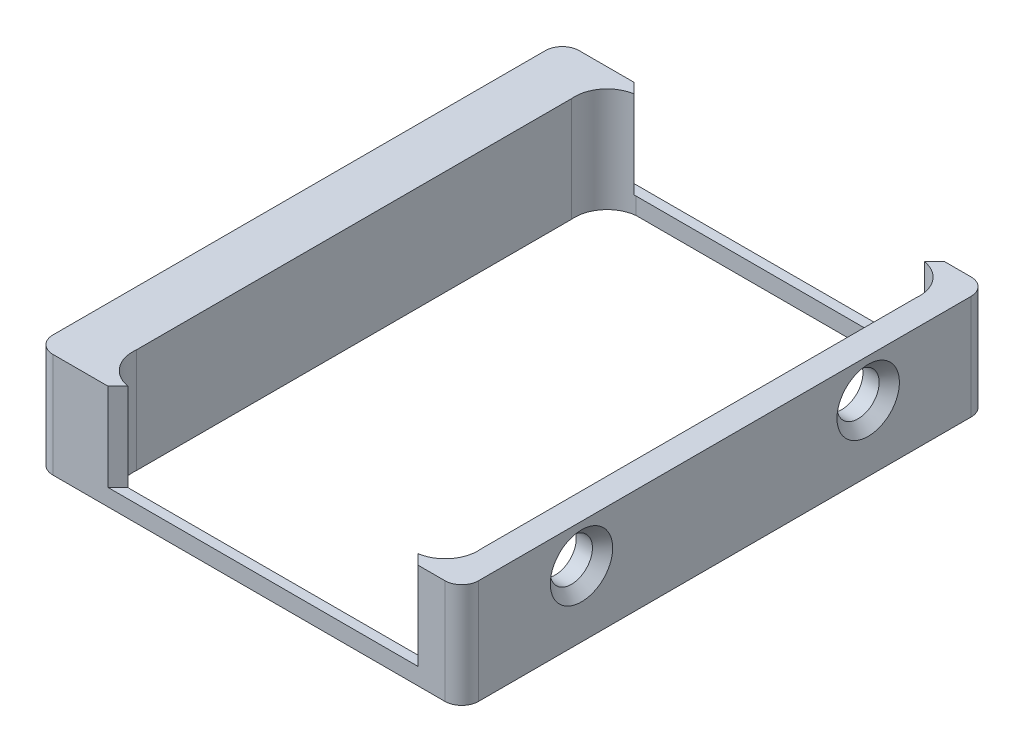
ISO-10303-21;
HEADER;
FILE_DESCRIPTION(('STEP AP214'),'2;1');
FILE_NAME('part.step','',(''),(''),'','','');
FILE_SCHEMA(('AUTOMOTIVE_DESIGN { 1 0 10303 214 1 1 1 1 }'));
ENDSEC;
DATA;
#1=APPLICATION_CONTEXT('core data for automotive mechanical design processes');
#2=APPLICATION_PROTOCOL_DEFINITION('international standard','automotive_design',2000,#1);
#3=PRODUCT_CONTEXT('',#1,'mechanical');
#4=PRODUCT('Part','Part','',(#3));
#5=PRODUCT_RELATED_PRODUCT_CATEGORY('part','',(#4));
#6=PRODUCT_DEFINITION_FORMATION('','',#4);
#7=PRODUCT_DEFINITION_CONTEXT('part definition',#1,'design');
#8=PRODUCT_DEFINITION('design','',#6,#7);
#9=PRODUCT_DEFINITION_SHAPE('','',#8);
#10=(LENGTH_UNIT() NAMED_UNIT(*) SI_UNIT(.MILLI.,.METRE.));
#11=(NAMED_UNIT(*) PLANE_ANGLE_UNIT() SI_UNIT($,.RADIAN.));
#12=(NAMED_UNIT(*) SI_UNIT($,.STERADIAN.) SOLID_ANGLE_UNIT());
#13=UNCERTAINTY_MEASURE_WITH_UNIT(LENGTH_MEASURE(1.E-05),#10,'distance_accuracy_value','');
#14=(GEOMETRIC_REPRESENTATION_CONTEXT(3) GLOBAL_UNCERTAINTY_ASSIGNED_CONTEXT((#13)) GLOBAL_UNIT_ASSIGNED_CONTEXT((#10,
#11,#12)) REPRESENTATION_CONTEXT('',''));
#15=CARTESIAN_POINT('',(0.,0.,0.));
#16=DIRECTION('',(0.,0.,1.));
#17=DIRECTION('',(1.,0.,0.));
#18=AXIS2_PLACEMENT_3D('',#15,#16,#17);
#19=CARTESIAN_POINT('',(58.9,31.,78.));
#20=DIRECTION('',(-1.,0.,0.));
#21=DIRECTION('',(0.,0.,1.));
#22=AXIS2_PLACEMENT_3D('',#19,#20,#21);
#23=PLANE('',#22);
#24=CARTESIAN_POINT('',(58.9,19.55,-42.5));
#25=DIRECTION('',(-1.,0.,0.));
#26=DIRECTION('',(0.,0.,1.));
#27=AXIS2_PLACEMENT_3D('',#24,#25,#26);
#28=CIRCLE('',#27,9.25000000000001);
#29=CARTESIAN_POINT('',(58.9,19.55,-33.25));
#30=VERTEX_POINT('',#29);
#31=EDGE_CURVE('E57',#30,#30,#28,.T.);
#32=ORIENTED_EDGE('',*,*,#31,.T.);
#33=EDGE_LOOP('',(#32));
#34=FACE_BOUND('',#33,.T.);
#35=CARTESIAN_POINT('',(58.9,19.55,42.5));
#36=DIRECTION('',(-1.,0.,0.));
#37=DIRECTION('',(0.,0.,1.));
#38=AXIS2_PLACEMENT_3D('',#35,#36,#37);
#39=CIRCLE('',#38,9.25000000000004);
#40=CARTESIAN_POINT('',(58.9,19.55,51.75));
#41=VERTEX_POINT('',#40);
#42=EDGE_CURVE('E481',#41,#41,#39,.T.);
#43=ORIENTED_EDGE('',*,*,#42,.T.);
#44=EDGE_LOOP('',(#43));
#45=FACE_BOUND('',#44,.T.);
#46=DIRECTION('',(0.,0.,-1.));
#47=VECTOR('',#46,1.);
#48=CARTESIAN_POINT('',(58.9,0.,78.));
#49=LINE('',#48,#47);
#50=CARTESIAN_POINT('',(58.9,0.,73.));
#51=VERTEX_POINT('',#50);
#52=CARTESIAN_POINT('',(58.9,0.,-73.));
#53=VERTEX_POINT('',#52);
#54=EDGE_CURVE('E396',#51,#53,#49,.T.);
#55=ORIENTED_EDGE('',*,*,#54,.T.);
#56=DIRECTION('',(0.,-1.,0.));
#57=VECTOR('',#56,1.);
#58=CARTESIAN_POINT('',(58.9,31.,-73.));
#59=LINE('',#58,#57);
#60=CARTESIAN_POINT('',(58.9,31.,-73.));
#61=VERTEX_POINT('',#60);
#62=EDGE_CURVE('E72',#53,#61,#59,.F.);
#63=ORIENTED_EDGE('',*,*,#62,.T.);
#64=DIRECTION('',(0.,0.,-1.));
#65=VECTOR('',#64,1.);
#66=CARTESIAN_POINT('',(58.9,31.,78.));
#67=LINE('',#66,#65);
#68=CARTESIAN_POINT('',(58.9,31.,73.));
#69=VERTEX_POINT('',#68);
#70=EDGE_CURVE('E382',#69,#61,#67,.T.);
#71=ORIENTED_EDGE('',*,*,#70,.F.);
#72=DIRECTION('',(0.,-1.,0.));
#73=VECTOR('',#72,1.);
#74=CARTESIAN_POINT('',(58.9,31.,73.));
#75=LINE('',#74,#73);
#76=EDGE_CURVE('E452',#69,#51,#75,.T.);
#77=ORIENTED_EDGE('',*,*,#76,.T.);
#78=EDGE_LOOP('',(#55,#63,#71,#77));
#79=FACE_BOUND('',#78,.T.);
#80=ADVANCED_FACE('F47',(#34,#45,#79),#23,.F.);
#81=CARTESIAN_POINT('',(0.,31.,0.));
#82=DIRECTION('',(0.,1.,0.));
#83=DIRECTION('',(0.,0.,1.));
#84=AXIS2_PLACEMENT_3D('',#81,#82,#83);
#85=PLANE('',#84);
#86=DIRECTION('',(-1.,0.,0.));
#87=VECTOR('',#86,1.);
#88=CARTESIAN_POINT('',(-67.3,31.,-78.));
#89=LINE('',#88,#87);
#90=CARTESIAN_POINT('',(-46.,31.,-78.));
#91=VERTEX_POINT('',#90);
#92=CARTESIAN_POINT('',(-62.3,31.,-78.));
#93=VERTEX_POINT('',#92);
#94=EDGE_CURVE('E374',#91,#93,#89,.T.);
#95=ORIENTED_EDGE('',*,*,#94,.T.);
#96=CARTESIAN_POINT('',(-62.3,31.,-73.));
#97=DIRECTION('',(0.,1.,0.));
#98=DIRECTION('',(0.,0.,1.));
#99=AXIS2_PLACEMENT_3D('',#96,#97,#98);
#100=CIRCLE('',#99,5.);
#101=CARTESIAN_POINT('',(-67.3,31.,-73.));
#102=VERTEX_POINT('',#101);
#103=EDGE_CURVE('E449',#93,#102,#100,.T.);
#104=ORIENTED_EDGE('',*,*,#103,.T.);
#105=DIRECTION('',(0.,0.,1.));
#106=VECTOR('',#105,1.);
#107=CARTESIAN_POINT('',(-67.3,31.,78.));
#108=LINE('',#107,#106);
#109=CARTESIAN_POINT('',(-67.3,31.,73.));
#110=VERTEX_POINT('',#109);
#111=EDGE_CURVE('E373',#102,#110,#108,.T.);
#112=ORIENTED_EDGE('',*,*,#111,.T.);
#113=CARTESIAN_POINT('',(-62.3,31.,73.));
#114=DIRECTION('',(0.,1.,0.));
#115=DIRECTION('',(0.,0.,1.));
#116=AXIS2_PLACEMENT_3D('',#113,#114,#115);
#117=CIRCLE('',#116,5.);
#118=CARTESIAN_POINT('',(-62.3,31.,78.));
#119=VERTEX_POINT('',#118);
#120=EDGE_CURVE('E446',#110,#119,#117,.T.);
#121=ORIENTED_EDGE('',*,*,#120,.T.);
#122=DIRECTION('',(1.,0.,0.));
#123=VECTOR('',#122,1.);
#124=CARTESIAN_POINT('',(-67.3,31.,78.));
#125=LINE('',#124,#123);
#126=CARTESIAN_POINT('',(-46.,31.,78.));
#127=VERTEX_POINT('',#126);
#128=EDGE_CURVE('E379',#119,#127,#125,.T.);
#129=ORIENTED_EDGE('',*,*,#128,.T.);
#130=DIRECTION('',(0.707106781186555,0.,-0.70710678118654));
#131=VECTOR('',#130,1.);
#132=CARTESIAN_POINT('',(16.0000000000005,31.,16.0000000000008));
#133=LINE('',#132,#131);
#134=CARTESIAN_POINT('',(-43.0299186250794,31.,75.0299186250794));
#135=VERTEX_POINT('',#134);
#136=EDGE_CURVE('E221',#127,#135,#133,.T.);
#137=ORIENTED_EDGE('',*,*,#136,.T.);
#138=CARTESIAN_POINT('',(-41.5,31.,65.5));
#139=DIRECTION('',(0.,1.,0.));
#140=DIRECTION('',(0.,0.,1.));
#141=AXIS2_PLACEMENT_3D('',#138,#139,#140);
#142=CIRCLE('',#141,9.65194280961093);
#143=CARTESIAN_POINT('',(-51.1,31.,64.5));
#144=VERTEX_POINT('',#143);
#145=EDGE_CURVE('E294',#144,#135,#142,.T.);
#146=ORIENTED_EDGE('',*,*,#145,.F.);
#147=DIRECTION('',(0.,0.,1.));
#148=VECTOR('',#147,1.);
#149=CARTESIAN_POINT('',(-51.1,31.,64.5));
#150=LINE('',#149,#148);
#151=CARTESIAN_POINT('',(-51.1,31.,-64.5));
#152=VERTEX_POINT('',#151);
#153=EDGE_CURVE('E312',#152,#144,#150,.T.);
#154=ORIENTED_EDGE('',*,*,#153,.F.);
#155=CARTESIAN_POINT('',(-41.5,31.,-65.5));
#156=DIRECTION('',(0.,1.,0.));
#157=DIRECTION('',(0.,0.,-1.));
#158=AXIS2_PLACEMENT_3D('',#155,#156,#157);
#159=CIRCLE('',#158,9.65194280961091);
#160=CARTESIAN_POINT('',(-43.0299186250794,31.,-75.0299186250794));
#161=VERTEX_POINT('',#160);
#162=EDGE_CURVE('E309',#161,#152,#159,.T.);
#163=ORIENTED_EDGE('',*,*,#162,.F.);
#164=DIRECTION('',(-0.707106781186549,0.,-0.707106781186546));
#165=VECTOR('',#164,1.);
#166=CARTESIAN_POINT('',(16.0000000000001,31.,-16.0000000000002));
#167=LINE('',#166,#165);
#168=EDGE_CURVE('E264',#161,#91,#167,.T.);
#169=ORIENTED_EDGE('',*,*,#168,.T.);
#170=EDGE_LOOP('',(#95,#104,#112,#121,#129,#137,#146,#154,#163,#169));
#171=FACE_BOUND('',#170,.T.);
#172=ADVANCED_FACE('F566',(#171),#85,.T.);
#173=ORIENTED_EDGE('',*,*,#70,.T.);
#174=CARTESIAN_POINT('',(53.9,31.,-73.));
#175=DIRECTION('',(0.,1.,0.));
#176=DIRECTION('',(0.,0.,1.));
#177=AXIS2_PLACEMENT_3D('',#174,#175,#176);
#178=CIRCLE('',#177,5.);
#179=CARTESIAN_POINT('',(53.9,31.,-78.));
#180=VERTEX_POINT('',#179);
#181=EDGE_CURVE('E460',#61,#180,#178,.T.);
#182=ORIENTED_EDGE('',*,*,#181,.T.);
#183=CARTESIAN_POINT('',(46.,31.,-78.));
#184=VERTEX_POINT('',#183);
#185=EDGE_CURVE('E370',#180,#184,#89,.T.);
#186=ORIENTED_EDGE('',*,*,#185,.T.);
#187=DIRECTION('',(0.707106781186549,0.,-0.707106781186546));
#188=VECTOR('',#187,1.);
#189=CARTESIAN_POINT('',(-16.0000000000001,31.,-16.0000000000002));
#190=LINE('',#189,#188);
#191=CARTESIAN_POINT('',(43.0299186250794,31.,-75.0299186250794));
#192=VERTEX_POINT('',#191);
#193=EDGE_CURVE('E275',#192,#184,#190,.T.);
#194=ORIENTED_EDGE('',*,*,#193,.F.);
#195=CARTESIAN_POINT('',(41.5,31.,-65.5));
#196=DIRECTION('',(0.,1.,0.));
#197=DIRECTION('',(0.,0.,-1.));
#198=AXIS2_PLACEMENT_3D('',#195,#196,#197);
#199=CIRCLE('',#198,9.65194280961098);
#200=CARTESIAN_POINT('',(51.1,31.,-64.5));
#201=VERTEX_POINT('',#200);
#202=EDGE_CURVE('E305',#201,#192,#199,.T.);
#203=ORIENTED_EDGE('',*,*,#202,.F.);
#204=DIRECTION('',(0.,0.,-1.));
#205=VECTOR('',#204,1.);
#206=CARTESIAN_POINT('',(51.1,31.,64.5));
#207=LINE('',#206,#205);
#208=CARTESIAN_POINT('',(51.1,31.,64.5));
#209=VERTEX_POINT('',#208);
#210=EDGE_CURVE('E302',#209,#201,#207,.T.);
#211=ORIENTED_EDGE('',*,*,#210,.F.);
#212=CARTESIAN_POINT('',(41.5,31.,65.5));
#213=DIRECTION('',(0.,1.,0.));
#214=DIRECTION('',(0.,0.,1.));
#215=AXIS2_PLACEMENT_3D('',#212,#213,#214);
#216=CIRCLE('',#215,9.65194280961099);
#217=CARTESIAN_POINT('',(43.0299186250794,31.,75.0299186250794));
#218=VERTEX_POINT('',#217);
#219=EDGE_CURVE('E298',#218,#209,#216,.T.);
#220=ORIENTED_EDGE('',*,*,#219,.F.);
#221=DIRECTION('',(0.707106781186549,0.,0.707106781186546));
#222=VECTOR('',#221,1.);
#223=CARTESIAN_POINT('',(-16.0000000000001,31.,16.0000000000002));
#224=LINE('',#223,#222);
#225=CARTESIAN_POINT('',(46.,31.,78.));
#226=VERTEX_POINT('',#225);
#227=EDGE_CURVE('E236',#218,#226,#224,.T.);
#228=ORIENTED_EDGE('',*,*,#227,.T.);
#229=CARTESIAN_POINT('',(53.9,31.,78.));
#230=VERTEX_POINT('',#229);
#231=EDGE_CURVE('E378',#226,#230,#125,.T.);
#232=ORIENTED_EDGE('',*,*,#231,.T.);
#233=CARTESIAN_POINT('',(53.9,31.,73.));
#234=DIRECTION('',(0.,1.,0.));
#235=DIRECTION('',(0.,0.,1.));
#236=AXIS2_PLACEMENT_3D('',#233,#234,#235);
#237=CIRCLE('',#236,5.);
#238=EDGE_CURVE('E458',#230,#69,#237,.T.);
#239=ORIENTED_EDGE('',*,*,#238,.T.);
#240=EDGE_LOOP('',(#173,#182,#186,#194,#203,#211,#220,#228,#232,#239));
#241=FACE_BOUND('',#240,.T.);
#242=ADVANCED_FACE('F527',(#241),#85,.T.);
#243=CARTESIAN_POINT('',(-67.3,31.,-78.));
#244=DIRECTION('',(0.,0.,1.));
#245=DIRECTION('',(1.,0.,0.));
#246=AXIS2_PLACEMENT_3D('',#243,#244,#245);
#247=PLANE('',#246);
#248=DIRECTION('',(-1.,0.,0.));
#249=VECTOR('',#248,1.);
#250=CARTESIAN_POINT('',(-67.3,0.,-78.));
#251=LINE('',#250,#249);
#252=CARTESIAN_POINT('',(53.9,0.,-78.));
#253=VERTEX_POINT('',#252);
#254=CARTESIAN_POINT('',(-62.3,0.,-78.));
#255=VERTEX_POINT('',#254);
#256=EDGE_CURVE('E369',#253,#255,#251,.T.);
#257=ORIENTED_EDGE('',*,*,#256,.T.);
#258=DIRECTION('',(0.,-1.,0.));
#259=VECTOR('',#258,1.);
#260=CARTESIAN_POINT('',(-62.3,31.,-78.));
#261=LINE('',#260,#259);
#262=EDGE_CURVE('E443',#255,#93,#261,.F.);
#263=ORIENTED_EDGE('',*,*,#262,.T.);
#264=ORIENTED_EDGE('',*,*,#94,.F.);
#265=DIRECTION('',(0.,1.,0.));
#266=VECTOR('',#265,1.);
#267=CARTESIAN_POINT('',(-46.,5.,-78.));
#268=LINE('',#267,#266);
#269=CARTESIAN_POINT('',(-46.,5.,-78.));
#270=VERTEX_POINT('',#269);
#271=EDGE_CURVE('E253',#270,#91,#268,.T.);
#272=ORIENTED_EDGE('',*,*,#271,.F.);
#273=DIRECTION('',(-1.,0.,0.));
#274=VECTOR('',#273,1.);
#275=CARTESIAN_POINT('',(0.,5.,-78.));
#276=LINE('',#275,#274);
#277=CARTESIAN_POINT('',(46.,5.,-78.));
#278=VERTEX_POINT('',#277);
#279=EDGE_CURVE('E267',#278,#270,#276,.T.);
#280=ORIENTED_EDGE('',*,*,#279,.F.);
#281=DIRECTION('',(0.,1.,0.));
#282=VECTOR('',#281,1.);
#283=CARTESIAN_POINT('',(46.,5.,-78.));
#284=LINE('',#283,#282);
#285=EDGE_CURVE('E274',#278,#184,#284,.T.);
#286=ORIENTED_EDGE('',*,*,#285,.T.);
#287=ORIENTED_EDGE('',*,*,#185,.F.);
#288=DIRECTION('',(0.,-1.,0.));
#289=VECTOR('',#288,1.);
#290=CARTESIAN_POINT('',(53.9,31.,-78.));
#291=LINE('',#290,#289);
#292=EDGE_CURVE('E439',#180,#253,#291,.T.);
#293=ORIENTED_EDGE('',*,*,#292,.T.);
#294=EDGE_LOOP('',(#257,#263,#264,#272,#280,#286,#287,#293));
#295=FACE_BOUND('',#294,.T.);
#296=ADVANCED_FACE('F576',(#295),#247,.F.);
#297=CARTESIAN_POINT('',(-67.3,31.,78.));
#298=DIRECTION('',(0.,0.,-1.));
#299=DIRECTION('',(-1.,0.,0.));
#300=AXIS2_PLACEMENT_3D('',#297,#298,#299);
#301=PLANE('',#300);
#302=DIRECTION('',(1.,0.,0.));
#303=VECTOR('',#302,1.);
#304=CARTESIAN_POINT('',(-67.3,0.,78.));
#305=LINE('',#304,#303);
#306=CARTESIAN_POINT('',(-62.3,0.,78.));
#307=VERTEX_POINT('',#306);
#308=CARTESIAN_POINT('',(53.9,0.,78.));
#309=VERTEX_POINT('',#308);
#310=EDGE_CURVE('E393',#307,#309,#305,.T.);
#311=ORIENTED_EDGE('',*,*,#310,.T.);
#312=DIRECTION('',(0.,-1.,0.));
#313=VECTOR('',#312,1.);
#314=CARTESIAN_POINT('',(53.9,31.,78.));
#315=LINE('',#314,#313);
#316=EDGE_CURVE('E64',#309,#230,#315,.F.);
#317=ORIENTED_EDGE('',*,*,#316,.T.);
#318=ORIENTED_EDGE('',*,*,#231,.F.);
#319=DIRECTION('',(0.,1.,0.));
#320=VECTOR('',#319,1.);
#321=CARTESIAN_POINT('',(46.,5.,78.));
#322=LINE('',#321,#320);
#323=CARTESIAN_POINT('',(46.,5.,78.));
#324=VERTEX_POINT('',#323);
#325=EDGE_CURVE('E225',#324,#226,#322,.T.);
#326=ORIENTED_EDGE('',*,*,#325,.F.);
#327=DIRECTION('',(1.,0.,0.));
#328=VECTOR('',#327,1.);
#329=CARTESIAN_POINT('',(0.,5.,78.));
#330=LINE('',#329,#328);
#331=CARTESIAN_POINT('',(-46.,5.,78.));
#332=VERTEX_POINT('',#331);
#333=EDGE_CURVE('E231',#332,#324,#330,.T.);
#334=ORIENTED_EDGE('',*,*,#333,.F.);
#335=DIRECTION('',(0.,1.,0.));
#336=VECTOR('',#335,1.);
#337=CARTESIAN_POINT('',(-46.,5.,78.));
#338=LINE('',#337,#336);
#339=EDGE_CURVE('E215',#332,#127,#338,.T.);
#340=ORIENTED_EDGE('',*,*,#339,.T.);
#341=ORIENTED_EDGE('',*,*,#128,.F.);
#342=DIRECTION('',(0.,-1.,0.));
#343=VECTOR('',#342,1.);
#344=CARTESIAN_POINT('',(-62.3,31.,78.));
#345=LINE('',#344,#343);
#346=EDGE_CURVE('E463',#119,#307,#345,.T.);
#347=ORIENTED_EDGE('',*,*,#346,.T.);
#348=EDGE_LOOP('',(#311,#317,#318,#326,#334,#340,#341,#347));
#349=FACE_BOUND('',#348,.T.);
#350=ADVANCED_FACE('F238',(#349),#301,.F.);
#351=CARTESIAN_POINT('',(-41.5,31.,65.5));
#352=DIRECTION('',(0.,-1.,0.));
#353=DIRECTION('',(0.,0.,-1.));
#354=AXIS2_PLACEMENT_3D('',#351,#352,#353);
#355=CYLINDRICAL_SURFACE('',#354,9.65194280961093);
#356=ORIENTED_EDGE('',*,*,#145,.T.);
#357=DIRECTION('',(0.,-1.,0.));
#358=VECTOR('',#357,1.);
#359=CARTESIAN_POINT('',(-43.0299186250794,31.,75.0299186250794));
#360=LINE('',#359,#358);
#361=CARTESIAN_POINT('',(-43.0299186250794,5.,75.0299186250794));
#362=VERTEX_POINT('',#361);
#363=EDGE_CURVE('E417',#135,#362,#360,.T.);
#364=ORIENTED_EDGE('',*,*,#363,.T.);
#365=CARTESIAN_POINT('',(-41.5,5.,65.5));
#366=DIRECTION('',(0.,1.,0.));
#367=DIRECTION('',(0.,0.,1.));
#368=AXIS2_PLACEMENT_3D('',#365,#366,#367);
#369=CIRCLE('',#368,9.65194280961093);
#370=CARTESIAN_POINT('',(-42.5,5.,75.1));
#371=VERTEX_POINT('',#370);
#372=EDGE_CURVE('E234',#362,#371,#369,.T.);
#373=ORIENTED_EDGE('',*,*,#372,.T.);
#374=DIRECTION('',(0.,-1.,0.));
#375=VECTOR('',#374,1.);
#376=CARTESIAN_POINT('',(-42.5,31.,75.1));
#377=LINE('',#376,#375);
#378=CARTESIAN_POINT('',(-42.5,0.,75.1));
#379=VERTEX_POINT('',#378);
#380=EDGE_CURVE('E366',#371,#379,#377,.T.);
#381=ORIENTED_EDGE('',*,*,#380,.T.);
#382=CARTESIAN_POINT('',(-41.5,0.,65.5));
#383=DIRECTION('',(0.,1.,0.));
#384=DIRECTION('',(0.,0.,1.));
#385=AXIS2_PLACEMENT_3D('',#382,#383,#384);
#386=CIRCLE('',#385,9.65194280961093);
#387=CARTESIAN_POINT('',(-51.1,0.,64.5));
#388=VERTEX_POINT('',#387);
#389=EDGE_CURVE('E293',#388,#379,#386,.T.);
#390=ORIENTED_EDGE('',*,*,#389,.F.);
#391=DIRECTION('',(0.,-1.,0.));
#392=VECTOR('',#391,1.);
#393=CARTESIAN_POINT('',(-51.1,31.,64.5));
#394=LINE('',#393,#392);
#395=EDGE_CURVE('E315',#144,#388,#394,.T.);
#396=ORIENTED_EDGE('',*,*,#395,.F.);
#397=EDGE_LOOP('',(#356,#364,#373,#381,#390,#396));
#398=FACE_BOUND('',#397,.T.);
#399=ADVANCED_FACE('F549',(#398),#355,.F.);
#400=CARTESIAN_POINT('',(-42.5,31.,75.1));
#401=DIRECTION('',(0.,0.,-1.));
#402=DIRECTION('',(-1.,0.,0.));
#403=AXIS2_PLACEMENT_3D('',#400,#401,#402);
#404=PLANE('',#403);
#405=ORIENTED_EDGE('',*,*,#380,.F.);
#406=DIRECTION('',(1.,0.,0.));
#407=VECTOR('',#406,1.);
#408=CARTESIAN_POINT('',(0.,5.,75.1));
#409=LINE('',#408,#407);
#410=CARTESIAN_POINT('',(42.5,5.,75.1));
#411=VERTEX_POINT('',#410);
#412=EDGE_CURVE('E226',#371,#411,#409,.T.);
#413=ORIENTED_EDGE('',*,*,#412,.T.);
#414=DIRECTION('',(0.,-1.,0.));
#415=VECTOR('',#414,1.);
#416=CARTESIAN_POINT('',(42.5,31.,75.1));
#417=LINE('',#416,#415);
#418=CARTESIAN_POINT('',(42.5,0.,75.1));
#419=VERTEX_POINT('',#418);
#420=EDGE_CURVE('E363',#411,#419,#417,.T.);
#421=ORIENTED_EDGE('',*,*,#420,.T.);
#422=DIRECTION('',(1.,0.,0.));
#423=VECTOR('',#422,1.);
#424=CARTESIAN_POINT('',(-42.5,0.,75.1));
#425=LINE('',#424,#423);
#426=EDGE_CURVE('E319',#379,#419,#425,.T.);
#427=ORIENTED_EDGE('',*,*,#426,.F.);
#428=EDGE_LOOP('',(#405,#413,#421,#427));
#429=FACE_BOUND('',#428,.T.);
#430=ADVANCED_FACE('F553',(#429),#404,.T.);
#431=CARTESIAN_POINT('',(41.5,31.,65.5));
#432=DIRECTION('',(0.,-1.,0.));
#433=DIRECTION('',(0.,0.,-1.));
#434=AXIS2_PLACEMENT_3D('',#431,#432,#433);
#435=CYLINDRICAL_SURFACE('',#434,9.65194280961099);
#436=CARTESIAN_POINT('',(41.5,5.,65.5));
#437=DIRECTION('',(0.,1.,0.));
#438=DIRECTION('',(0.,0.,1.));
#439=AXIS2_PLACEMENT_3D('',#436,#437,#438);
#440=CIRCLE('',#439,9.65194280961099);
#441=CARTESIAN_POINT('',(43.0299186250794,5.,75.0299186250794));
#442=VERTEX_POINT('',#441);
#443=EDGE_CURVE('E409',#411,#442,#440,.T.);
#444=ORIENTED_EDGE('',*,*,#443,.T.);
#445=DIRECTION('',(0.,-1.,0.));
#446=VECTOR('',#445,1.);
#447=CARTESIAN_POINT('',(43.0299186250794,31.,75.0299186250794));
#448=LINE('',#447,#446);
#449=EDGE_CURVE('E413',#442,#218,#448,.F.);
#450=ORIENTED_EDGE('',*,*,#449,.T.);
#451=ORIENTED_EDGE('',*,*,#219,.T.);
#452=DIRECTION('',(0.,-1.,0.));
#453=VECTOR('',#452,1.);
#454=CARTESIAN_POINT('',(51.1,31.,64.5));
#455=LINE('',#454,#453);
#456=CARTESIAN_POINT('',(51.1,0.,64.5));
#457=VERTEX_POINT('',#456);
#458=EDGE_CURVE('E360',#209,#457,#455,.T.);
#459=ORIENTED_EDGE('',*,*,#458,.T.);
#460=CARTESIAN_POINT('',(41.5,0.,65.5));
#461=DIRECTION('',(0.,1.,0.));
#462=DIRECTION('',(0.,0.,1.));
#463=AXIS2_PLACEMENT_3D('',#460,#461,#462);
#464=CIRCLE('',#463,9.65194280961099);
#465=EDGE_CURVE('E323',#419,#457,#464,.T.);
#466=ORIENTED_EDGE('',*,*,#465,.F.);
#467=ORIENTED_EDGE('',*,*,#420,.F.);
#468=EDGE_LOOP('',(#444,#450,#451,#459,#466,#467));
#469=FACE_BOUND('',#468,.T.);
#470=ADVANCED_FACE('F523',(#469),#435,.F.);
#471=CARTESIAN_POINT('',(-42.5,31.,-75.1));
#472=DIRECTION('',(0.,0.,1.));
#473=DIRECTION('',(1.,0.,0.));
#474=AXIS2_PLACEMENT_3D('',#471,#472,#473);
#475=PLANE('',#474);
#476=DIRECTION('',(0.,-1.,0.));
#477=VECTOR('',#476,1.);
#478=CARTESIAN_POINT('',(42.5,31.,-75.1));
#479=LINE('',#478,#477);
#480=CARTESIAN_POINT('',(42.5,5.,-75.1));
#481=VERTEX_POINT('',#480);
#482=CARTESIAN_POINT('',(42.5,0.,-75.1));
#483=VERTEX_POINT('',#482);
#484=EDGE_CURVE('E354',#481,#483,#479,.T.);
#485=ORIENTED_EDGE('',*,*,#484,.F.);
#486=DIRECTION('',(1.,0.,0.));
#487=VECTOR('',#486,1.);
#488=CARTESIAN_POINT('',(0.,5.,-75.1));
#489=LINE('',#488,#487);
#490=CARTESIAN_POINT('',(-42.5,5.,-75.1));
#491=VERTEX_POINT('',#490);
#492=EDGE_CURVE('E260',#491,#481,#489,.T.);
#493=ORIENTED_EDGE('',*,*,#492,.F.);
#494=DIRECTION('',(0.,-1.,0.));
#495=VECTOR('',#494,1.);
#496=CARTESIAN_POINT('',(-42.5,31.,-75.1));
#497=LINE('',#496,#495);
#498=CARTESIAN_POINT('',(-42.5,0.,-75.1));
#499=VERTEX_POINT('',#498);
#500=EDGE_CURVE('E352',#491,#499,#497,.T.);
#501=ORIENTED_EDGE('',*,*,#500,.T.);
#502=DIRECTION('',(-1.,0.,0.));
#503=VECTOR('',#502,1.);
#504=CARTESIAN_POINT('',(-42.5,0.,-75.1));
#505=LINE('',#504,#503);
#506=EDGE_CURVE('E335',#483,#499,#505,.T.);
#507=ORIENTED_EDGE('',*,*,#506,.F.);
#508=EDGE_LOOP('',(#485,#493,#501,#507));
#509=FACE_BOUND('',#508,.T.);
#510=ADVANCED_FACE('F536',(#509),#475,.T.);
#511=CARTESIAN_POINT('',(-41.5,31.,-65.5));
#512=DIRECTION('',(0.,-1.,0.));
#513=DIRECTION('',(0.,0.,-1.));
#514=AXIS2_PLACEMENT_3D('',#511,#512,#513);
#515=CYLINDRICAL_SURFACE('',#514,9.65194280961091);
#516=CARTESIAN_POINT('',(-41.5,5.,-65.5));
#517=DIRECTION('',(0.,1.,0.));
#518=DIRECTION('',(0.,0.,1.));
#519=AXIS2_PLACEMENT_3D('',#516,#517,#518);
#520=CIRCLE('',#519,9.65194280961091);
#521=CARTESIAN_POINT('',(-43.0299186250794,5.,-75.0299186250794));
#522=VERTEX_POINT('',#521);
#523=EDGE_CURVE('E385',#491,#522,#520,.T.);
#524=ORIENTED_EDGE('',*,*,#523,.T.);
#525=DIRECTION('',(0.,-1.,0.));
#526=VECTOR('',#525,1.);
#527=CARTESIAN_POINT('',(-43.0299186250794,31.,-75.0299186250794));
#528=LINE('',#527,#526);
#529=EDGE_CURVE('E402',#522,#161,#528,.F.);
#530=ORIENTED_EDGE('',*,*,#529,.T.);
#531=ORIENTED_EDGE('',*,*,#162,.T.);
#532=DIRECTION('',(0.,-1.,0.));
#533=VECTOR('',#532,1.);
#534=CARTESIAN_POINT('',(-51.1,31.,-64.5));
#535=LINE('',#534,#533);
#536=CARTESIAN_POINT('',(-51.1,0.,-64.5));
#537=VERTEX_POINT('',#536);
#538=EDGE_CURVE('E349',#152,#537,#535,.T.);
#539=ORIENTED_EDGE('',*,*,#538,.T.);
#540=CARTESIAN_POINT('',(-41.5,0.,-65.5));
#541=DIRECTION('',(0.,1.,0.));
#542=DIRECTION('',(0.,0.,-1.));
#543=AXIS2_PLACEMENT_3D('',#540,#541,#542);
#544=CIRCLE('',#543,9.65194280961091);
#545=EDGE_CURVE('E339',#499,#537,#544,.T.);
#546=ORIENTED_EDGE('',*,*,#545,.F.);
#547=ORIENTED_EDGE('',*,*,#500,.F.);
#548=EDGE_LOOP('',(#524,#530,#531,#539,#546,#547));
#549=FACE_BOUND('',#548,.T.);
#550=ADVANCED_FACE('F540',(#549),#515,.F.);
#551=CARTESIAN_POINT('',(0.,0.,0.));
#552=DIRECTION('',(0.,1.,0.));
#553=DIRECTION('',(0.,0.,1.));
#554=AXIS2_PLACEMENT_3D('',#551,#552,#553);
#555=PLANE('',#554);
#556=CARTESIAN_POINT('',(53.7050082180734,0.,73.3482193616655));
#557=DIRECTION('',(0.,-1.,0.));
#558=DIRECTION('',(0.,0.,-1.));
#559=AXIS2_PLACEMENT_3D('',#556,#557,#558);
#560=CIRCLE('',#559,2.1);
#561=CARTESIAN_POINT('',(53.7050082180734,0.,71.2482193616655));
#562=VERTEX_POINT('',#561);
#563=EDGE_CURVE('E650',#562,#562,#560,.T.);
#564=ORIENTED_EDGE('',*,*,#563,.F.);
#565=EDGE_LOOP('',(#564));
#566=FACE_BOUND('',#565,.T.);
#567=CARTESIAN_POINT('',(-58.4934425788602,0.,-70.9643370582062));
#568=DIRECTION('',(0.,-1.,0.));
#569=DIRECTION('',(0.,0.,-1.));
#570=AXIS2_PLACEMENT_3D('',#567,#568,#569);
#571=CIRCLE('',#570,2.1);
#572=CARTESIAN_POINT('',(-58.4934425788602,0.,-73.0643370582062));
#573=VERTEX_POINT('',#572);
#574=EDGE_CURVE('E656',#573,#573,#571,.T.);
#575=ORIENTED_EDGE('',*,*,#574,.F.);
#576=EDGE_LOOP('',(#575));
#577=FACE_BOUND('',#576,.T.);
#578=CARTESIAN_POINT('',(53.7050082180734,0.,-73.3482193616655));
#579=DIRECTION('',(0.,-1.,0.));
#580=DIRECTION('',(0.,0.,-1.));
#581=AXIS2_PLACEMENT_3D('',#578,#579,#580);
#582=CIRCLE('',#581,2.1);
#583=CARTESIAN_POINT('',(53.7050082180734,0.,-75.4482193616655));
#584=VERTEX_POINT('',#583);
#585=EDGE_CURVE('E638',#584,#584,#582,.T.);
#586=ORIENTED_EDGE('',*,*,#585,.F.);
#587=EDGE_LOOP('',(#586));
#588=FACE_BOUND('',#587,.T.);
#589=CARTESIAN_POINT('',(-58.4934425788602,0.,70.9643370582062));
#590=DIRECTION('',(0.,-1.,0.));
#591=DIRECTION('',(0.,0.,-1.));
#592=AXIS2_PLACEMENT_3D('',#589,#590,#591);
#593=CIRCLE('',#592,2.1);
#594=CARTESIAN_POINT('',(-58.4934425788602,0.,68.8643370582062));
#595=VERTEX_POINT('',#594);
#596=EDGE_CURVE('E647',#595,#595,#593,.T.);
#597=ORIENTED_EDGE('',*,*,#596,.F.);
#598=EDGE_LOOP('',(#597));
#599=FACE_BOUND('',#598,.T.);
#600=DIRECTION('',(0.,0.,1.));
#601=VECTOR('',#600,1.);
#602=CARTESIAN_POINT('',(-67.3,0.,78.));
#603=LINE('',#602,#601);
#604=CARTESIAN_POINT('',(-67.3,0.,-73.));
#605=VERTEX_POINT('',#604);
#606=CARTESIAN_POINT('',(-67.3,0.,73.));
#607=VERTEX_POINT('',#606);
#608=EDGE_CURVE('E389',#605,#607,#603,.T.);
#609=ORIENTED_EDGE('',*,*,#608,.F.);
#610=CARTESIAN_POINT('',(-62.3,0.,-73.));
#611=DIRECTION('',(0.,1.,0.));
#612=DIRECTION('',(0.,0.,1.));
#613=AXIS2_PLACEMENT_3D('',#610,#611,#612);
#614=CIRCLE('',#613,5.);
#615=EDGE_CURVE('E436',#605,#255,#614,.F.);
#616=ORIENTED_EDGE('',*,*,#615,.T.);
#617=ORIENTED_EDGE('',*,*,#256,.F.);
#618=CARTESIAN_POINT('',(53.9,0.,-73.));
#619=DIRECTION('',(0.,1.,0.));
#620=DIRECTION('',(0.,0.,1.));
#621=AXIS2_PLACEMENT_3D('',#618,#619,#620);
#622=CIRCLE('',#621,5.);
#623=EDGE_CURVE('E433',#253,#53,#622,.F.);
#624=ORIENTED_EDGE('',*,*,#623,.T.);
#625=ORIENTED_EDGE('',*,*,#54,.F.);
#626=CARTESIAN_POINT('',(53.9,0.,73.));
#627=DIRECTION('',(0.,1.,0.));
#628=DIRECTION('',(0.,0.,1.));
#629=AXIS2_PLACEMENT_3D('',#626,#627,#628);
#630=CIRCLE('',#629,5.);
#631=EDGE_CURVE('E430',#51,#309,#630,.F.);
#632=ORIENTED_EDGE('',*,*,#631,.T.);
#633=ORIENTED_EDGE('',*,*,#310,.F.);
#634=CARTESIAN_POINT('',(-62.3,0.,73.));
#635=DIRECTION('',(0.,1.,0.));
#636=DIRECTION('',(0.,0.,1.));
#637=AXIS2_PLACEMENT_3D('',#634,#635,#636);
#638=CIRCLE('',#637,5.);
#639=EDGE_CURVE('E427',#307,#607,#638,.F.);
#640=ORIENTED_EDGE('',*,*,#639,.T.);
#641=EDGE_LOOP('',(#609,#616,#617,#624,#625,#632,#633,#640));
#642=FACE_BOUND('',#641,.T.);
#643=ORIENTED_EDGE('',*,*,#389,.T.);
#644=ORIENTED_EDGE('',*,*,#426,.T.);
#645=ORIENTED_EDGE('',*,*,#465,.T.);
#646=DIRECTION('',(0.,0.,-1.));
#647=VECTOR('',#646,1.);
#648=CARTESIAN_POINT('',(51.1,0.,64.5));
#649=LINE('',#648,#647);
#650=CARTESIAN_POINT('',(51.1,0.,-64.5));
#651=VERTEX_POINT('',#650);
#652=EDGE_CURVE('E327',#457,#651,#649,.T.);
#653=ORIENTED_EDGE('',*,*,#652,.T.);
#654=CARTESIAN_POINT('',(41.5,0.,-65.5));
#655=DIRECTION('',(0.,1.,0.));
#656=DIRECTION('',(0.,0.,-1.));
#657=AXIS2_PLACEMENT_3D('',#654,#655,#656);
#658=CIRCLE('',#657,9.65194280961098);
#659=EDGE_CURVE('E331',#651,#483,#658,.T.);
#660=ORIENTED_EDGE('',*,*,#659,.T.);
#661=ORIENTED_EDGE('',*,*,#506,.T.);
#662=ORIENTED_EDGE('',*,*,#545,.T.);
#663=DIRECTION('',(0.,0.,1.));
#664=VECTOR('',#663,1.);
#665=CARTESIAN_POINT('',(-51.1,0.,64.5));
#666=LINE('',#665,#664);
#667=EDGE_CURVE('E299',#537,#388,#666,.T.);
#668=ORIENTED_EDGE('',*,*,#667,.T.);
#669=EDGE_LOOP('',(#643,#644,#645,#653,#660,#661,#662,#668));
#670=FACE_BOUND('',#669,.T.);
#671=ADVANCED_FACE('F519',(#566,#577,#588,#599,#642,#670),#555,.F.);
#672=CARTESIAN_POINT('',(-67.3,31.,78.));
#673=DIRECTION('',(1.,0.,0.));
#674=DIRECTION('',(0.,0.,-1.));
#675=AXIS2_PLACEMENT_3D('',#672,#673,#674);
#676=PLANE('',#675);
#677=CARTESIAN_POINT('',(-67.3,13.95,-11.));
#678=DIRECTION('',(-1.,0.,0.));
#679=DIRECTION('',(0.,0.,1.));
#680=AXIS2_PLACEMENT_3D('',#677,#678,#679);
#681=CIRCLE('',#680,2.1);
#682=CARTESIAN_POINT('',(-67.3,13.95,-8.9));
#683=VERTEX_POINT('',#682);
#684=EDGE_CURVE('E631',#683,#683,#681,.T.);
#685=ORIENTED_EDGE('',*,*,#684,.F.);
#686=EDGE_LOOP('',(#685));
#687=FACE_BOUND('',#686,.T.);
#688=CARTESIAN_POINT('',(-67.3,13.95,11.));
#689=DIRECTION('',(-1.,0.,0.));
#690=DIRECTION('',(0.,0.,-1.));
#691=AXIS2_PLACEMENT_3D('',#688,#689,#690);
#692=CIRCLE('',#691,2.1);
#693=CARTESIAN_POINT('',(-67.3,13.95,8.9));
#694=VERTEX_POINT('',#693);
#695=EDGE_CURVE('E629',#694,#694,#692,.T.);
#696=ORIENTED_EDGE('',*,*,#695,.F.);
#697=EDGE_LOOP('',(#696));
#698=FACE_BOUND('',#697,.T.);
#699=ORIENTED_EDGE('',*,*,#111,.F.);
#700=DIRECTION('',(0.,-1.,0.));
#701=VECTOR('',#700,1.);
#702=CARTESIAN_POINT('',(-67.3,31.,-73.));
#703=LINE('',#702,#701);
#704=EDGE_CURVE('E423',#102,#605,#703,.T.);
#705=ORIENTED_EDGE('',*,*,#704,.T.);
#706=ORIENTED_EDGE('',*,*,#608,.T.);
#707=DIRECTION('',(0.,-1.,0.));
#708=VECTOR('',#707,1.);
#709=CARTESIAN_POINT('',(-67.3,31.,73.));
#710=LINE('',#709,#708);
#711=EDGE_CURVE('E420',#607,#110,#710,.F.);
#712=ORIENTED_EDGE('',*,*,#711,.T.);
#713=EDGE_LOOP('',(#699,#705,#706,#712));
#714=FACE_BOUND('',#713,.T.);
#715=ADVANCED_FACE('F508',(#687,#698,#714),#676,.F.);
#716=CARTESIAN_POINT('',(51.1,31.,64.5));
#717=DIRECTION('',(-1.,0.,0.));
#718=DIRECTION('',(0.,0.,1.));
#719=AXIS2_PLACEMENT_3D('',#716,#717,#718);
#720=PLANE('',#719);
#721=CARTESIAN_POINT('',(51.1,19.55,-42.5));
#722=DIRECTION('',(-1.,0.,0.));
#723=DIRECTION('',(0.,0.,1.));
#724=AXIS2_PLACEMENT_3D('',#721,#722,#723);
#725=CIRCLE('',#724,6.25);
#726=CARTESIAN_POINT('',(51.1,19.55,-36.25));
#727=VERTEX_POINT('',#726);
#728=EDGE_CURVE('E473',#727,#727,#725,.T.);
#729=ORIENTED_EDGE('',*,*,#728,.F.);
#730=EDGE_LOOP('',(#729));
#731=FACE_BOUND('',#730,.T.);
#732=CARTESIAN_POINT('',(51.1,19.55,42.5));
#733=DIRECTION('',(-1.,0.,0.));
#734=DIRECTION('',(0.,0.,1.));
#735=AXIS2_PLACEMENT_3D('',#732,#733,#734);
#736=CIRCLE('',#735,6.25);
#737=CARTESIAN_POINT('',(51.1,19.55,48.75));
#738=VERTEX_POINT('',#737);
#739=EDGE_CURVE('E279',#738,#738,#736,.T.);
#740=ORIENTED_EDGE('',*,*,#739,.F.);
#741=EDGE_LOOP('',(#740));
#742=FACE_BOUND('',#741,.T.);
#743=ORIENTED_EDGE('',*,*,#652,.F.);
#744=ORIENTED_EDGE('',*,*,#458,.F.);
#745=ORIENTED_EDGE('',*,*,#210,.T.);
#746=DIRECTION('',(0.,-1.,0.));
#747=VECTOR('',#746,1.);
#748=CARTESIAN_POINT('',(51.1,31.,-64.5));
#749=LINE('',#748,#747);
#750=EDGE_CURVE('E357',#201,#651,#749,.T.);
#751=ORIENTED_EDGE('',*,*,#750,.T.);
#752=EDGE_LOOP('',(#743,#744,#745,#751));
#753=FACE_BOUND('',#752,.T.);
#754=ADVANCED_FACE('F504',(#731,#742,#753),#720,.T.);
#755=CARTESIAN_POINT('',(41.5,31.,-65.5));
#756=DIRECTION('',(0.,-1.,0.));
#757=DIRECTION('',(0.,0.,-1.));
#758=AXIS2_PLACEMENT_3D('',#755,#756,#757);
#759=CYLINDRICAL_SURFACE('',#758,9.65194280961098);
#760=DIRECTION('',(0.,-1.,0.));
#761=VECTOR('',#760,1.);
#762=CARTESIAN_POINT('',(43.0299186250794,31.,-75.0299186250794));
#763=LINE('',#762,#761);
#764=CARTESIAN_POINT('',(43.0299186250794,5.,-75.0299186250794));
#765=VERTEX_POINT('',#764);
#766=EDGE_CURVE('E406',#765,#192,#763,.F.);
#767=ORIENTED_EDGE('',*,*,#766,.F.);
#768=CARTESIAN_POINT('',(41.5,5.,-65.5));
#769=DIRECTION('',(0.,1.,0.));
#770=DIRECTION('',(0.,0.,1.));
#771=AXIS2_PLACEMENT_3D('',#768,#769,#770);
#772=CIRCLE('',#771,9.65194280961098);
#773=EDGE_CURVE('E258',#765,#481,#772,.T.);
#774=ORIENTED_EDGE('',*,*,#773,.T.);
#775=ORIENTED_EDGE('',*,*,#484,.T.);
#776=ORIENTED_EDGE('',*,*,#659,.F.);
#777=ORIENTED_EDGE('',*,*,#750,.F.);
#778=ORIENTED_EDGE('',*,*,#202,.T.);
#779=EDGE_LOOP('',(#767,#774,#775,#776,#777,#778));
#780=FACE_BOUND('',#779,.T.);
#781=ADVANCED_FACE('F507',(#780),#759,.F.);
#782=CARTESIAN_POINT('',(-51.1,31.,64.5));
#783=DIRECTION('',(1.,0.,0.));
#784=DIRECTION('',(0.,0.,-1.));
#785=AXIS2_PLACEMENT_3D('',#782,#783,#784);
#786=PLANE('',#785);
#787=ORIENTED_EDGE('',*,*,#667,.F.);
#788=ORIENTED_EDGE('',*,*,#538,.F.);
#789=ORIENTED_EDGE('',*,*,#153,.T.);
#790=ORIENTED_EDGE('',*,*,#395,.T.);
#791=EDGE_LOOP('',(#787,#788,#789,#790));
#792=FACE_BOUND('',#791,.T.);
#793=ADVANCED_FACE('F546',(#792),#786,.T.);
#794=CARTESIAN_POINT('',(16.0000000000001,5.,-16.0000000000002));
#795=DIRECTION('',(0.707106781186546,0.,-0.707106781186549));
#796=DIRECTION('',(-0.707106781186549,0.,-0.707106781186546));
#797=AXIS2_PLACEMENT_3D('',#794,#795,#796);
#798=PLANE('',#797);
#799=DIRECTION('',(-0.707106781186549,0.,-0.707106781186546));
#800=VECTOR('',#799,1.);
#801=CARTESIAN_POINT('',(16.0000000000001,5.,-16.0000000000002));
#802=LINE('',#801,#800);
#803=EDGE_CURVE('E271',#522,#270,#802,.T.);
#804=ORIENTED_EDGE('',*,*,#803,.T.);
#805=ORIENTED_EDGE('',*,*,#271,.T.);
#806=ORIENTED_EDGE('',*,*,#168,.F.);
#807=ORIENTED_EDGE('',*,*,#529,.F.);
#808=EDGE_LOOP('',(#804,#805,#806,#807));
#809=FACE_BOUND('',#808,.T.);
#810=ADVANCED_FACE('F789',(#809),#798,.T.);
#811=CARTESIAN_POINT('',(-16.0000000000001,5.,-16.0000000000002));
#812=DIRECTION('',(0.707106781186546,0.,0.707106781186549));
#813=DIRECTION('',(0.707106781186549,0.,-0.707106781186546));
#814=AXIS2_PLACEMENT_3D('',#811,#812,#813);
#815=PLANE('',#814);
#816=ORIENTED_EDGE('',*,*,#766,.T.);
#817=ORIENTED_EDGE('',*,*,#193,.T.);
#818=ORIENTED_EDGE('',*,*,#285,.F.);
#819=DIRECTION('',(0.707106781186549,0.,-0.707106781186546));
#820=VECTOR('',#819,1.);
#821=CARTESIAN_POINT('',(-16.0000000000001,5.,-16.0000000000002));
#822=LINE('',#821,#820);
#823=EDGE_CURVE('E263',#765,#278,#822,.T.);
#824=ORIENTED_EDGE('',*,*,#823,.F.);
#825=EDGE_LOOP('',(#816,#817,#818,#824));
#826=FACE_BOUND('',#825,.T.);
#827=ADVANCED_FACE('F794',(#826),#815,.F.);
#828=CARTESIAN_POINT('',(0.,5.,0.));
#829=DIRECTION('',(0.,1.,0.));
#830=DIRECTION('',(0.,0.,1.));
#831=AXIS2_PLACEMENT_3D('',#828,#829,#830);
#832=PLANE('',#831);
#833=ORIENTED_EDGE('',*,*,#823,.T.);
#834=ORIENTED_EDGE('',*,*,#279,.T.);
#835=ORIENTED_EDGE('',*,*,#803,.F.);
#836=ORIENTED_EDGE('',*,*,#523,.F.);
#837=ORIENTED_EDGE('',*,*,#492,.T.);
#838=ORIENTED_EDGE('',*,*,#773,.F.);
#839=EDGE_LOOP('',(#833,#834,#835,#836,#837,#838));
#840=FACE_BOUND('',#839,.T.);
#841=ADVANCED_FACE('F563',(#840),#832,.T.);
#842=CARTESIAN_POINT('',(16.0000000000005,5.,16.0000000000008));
#843=DIRECTION('',(0.70710678118654,0.,0.707106781186555));
#844=DIRECTION('',(0.707106781186555,0.,-0.70710678118654));
#845=AXIS2_PLACEMENT_3D('',#842,#843,#844);
#846=PLANE('',#845);
#847=ORIENTED_EDGE('',*,*,#136,.F.);
#848=ORIENTED_EDGE('',*,*,#339,.F.);
#849=DIRECTION('',(0.707106781186555,0.,-0.70710678118654));
#850=VECTOR('',#849,1.);
#851=CARTESIAN_POINT('',(16.0000000000005,5.,16.0000000000008));
#852=LINE('',#851,#850);
#853=EDGE_CURVE('E218',#332,#362,#852,.T.);
#854=ORIENTED_EDGE('',*,*,#853,.T.);
#855=ORIENTED_EDGE('',*,*,#363,.F.);
#856=EDGE_LOOP('',(#847,#848,#854,#855));
#857=FACE_BOUND('',#856,.T.);
#858=ADVANCED_FACE('F217',(#857),#846,.T.);
#859=CARTESIAN_POINT('',(-16.0000000000001,5.,16.0000000000002));
#860=DIRECTION('',(-0.707106781186546,0.,0.707106781186549));
#861=DIRECTION('',(0.707106781186549,0.,0.707106781186546));
#862=AXIS2_PLACEMENT_3D('',#859,#860,#861);
#863=PLANE('',#862);
#864=DIRECTION('',(0.707106781186549,0.,0.707106781186546));
#865=VECTOR('',#864,1.);
#866=CARTESIAN_POINT('',(-16.0000000000001,5.,16.0000000000002));
#867=LINE('',#866,#865);
#868=EDGE_CURVE('E240',#442,#324,#867,.T.);
#869=ORIENTED_EDGE('',*,*,#868,.T.);
#870=ORIENTED_EDGE('',*,*,#325,.T.);
#871=ORIENTED_EDGE('',*,*,#227,.F.);
#872=ORIENTED_EDGE('',*,*,#449,.F.);
#873=EDGE_LOOP('',(#869,#870,#871,#872));
#874=FACE_BOUND('',#873,.T.);
#875=ADVANCED_FACE('F555',(#874),#863,.T.);
#876=CARTESIAN_POINT('',(0.,5.,0.));
#877=DIRECTION('',(0.,1.,0.));
#878=DIRECTION('',(0.,0.,1.));
#879=AXIS2_PLACEMENT_3D('',#876,#877,#878);
#880=PLANE('',#879);
#881=ORIENTED_EDGE('',*,*,#853,.F.);
#882=ORIENTED_EDGE('',*,*,#333,.T.);
#883=ORIENTED_EDGE('',*,*,#868,.F.);
#884=ORIENTED_EDGE('',*,*,#443,.F.);
#885=ORIENTED_EDGE('',*,*,#412,.F.);
#886=ORIENTED_EDGE('',*,*,#372,.F.);
#887=EDGE_LOOP('',(#881,#882,#883,#884,#885,#886));
#888=FACE_BOUND('',#887,.T.);
#889=ADVANCED_FACE('F230',(#888),#880,.T.);
#890=CARTESIAN_POINT('',(-62.3,31.,-73.));
#891=DIRECTION('',(0.,-1.,0.));
#892=DIRECTION('',(0.,0.,-1.));
#893=AXIS2_PLACEMENT_3D('',#890,#891,#892);
#894=CYLINDRICAL_SURFACE('',#893,5.);
#895=ORIENTED_EDGE('',*,*,#103,.F.);
#896=ORIENTED_EDGE('',*,*,#262,.F.);
#897=ORIENTED_EDGE('',*,*,#615,.F.);
#898=ORIENTED_EDGE('',*,*,#704,.F.);
#899=EDGE_LOOP('',(#895,#896,#897,#898));
#900=FACE_BOUND('',#899,.T.);
#901=ADVANCED_FACE('F561',(#900),#894,.T.);
#902=CARTESIAN_POINT('',(53.9,31.,-73.));
#903=DIRECTION('',(0.,-1.,0.));
#904=DIRECTION('',(0.,0.,-1.));
#905=AXIS2_PLACEMENT_3D('',#902,#903,#904);
#906=CYLINDRICAL_SURFACE('',#905,5.);
#907=ORIENTED_EDGE('',*,*,#181,.F.);
#908=ORIENTED_EDGE('',*,*,#62,.F.);
#909=ORIENTED_EDGE('',*,*,#623,.F.);
#910=ORIENTED_EDGE('',*,*,#292,.F.);
#911=EDGE_LOOP('',(#907,#908,#909,#910));
#912=FACE_BOUND('',#911,.T.);
#913=ADVANCED_FACE('F585',(#912),#906,.T.);
#914=CARTESIAN_POINT('',(53.9,31.,73.));
#915=DIRECTION('',(0.,-1.,0.));
#916=DIRECTION('',(0.,0.,-1.));
#917=AXIS2_PLACEMENT_3D('',#914,#915,#916);
#918=CYLINDRICAL_SURFACE('',#917,5.);
#919=ORIENTED_EDGE('',*,*,#238,.F.);
#920=ORIENTED_EDGE('',*,*,#316,.F.);
#921=ORIENTED_EDGE('',*,*,#631,.F.);
#922=ORIENTED_EDGE('',*,*,#76,.F.);
#923=EDGE_LOOP('',(#919,#920,#921,#922));
#924=FACE_BOUND('',#923,.T.);
#925=ADVANCED_FACE('F589',(#924),#918,.T.);
#926=CARTESIAN_POINT('',(-62.3,31.,73.));
#927=DIRECTION('',(0.,-1.,0.));
#928=DIRECTION('',(0.,0.,-1.));
#929=AXIS2_PLACEMENT_3D('',#926,#927,#928);
#930=CYLINDRICAL_SURFACE('',#929,5.);
#931=ORIENTED_EDGE('',*,*,#120,.F.);
#932=ORIENTED_EDGE('',*,*,#711,.F.);
#933=ORIENTED_EDGE('',*,*,#639,.F.);
#934=ORIENTED_EDGE('',*,*,#346,.F.);
#935=EDGE_LOOP('',(#931,#932,#933,#934));
#936=FACE_BOUND('',#935,.T.);
#937=ADVANCED_FACE('F593',(#936),#930,.T.);
#938=CARTESIAN_POINT('',(58.9,19.55,42.5));
#939=DIRECTION('',(1.,0.,0.));
#940=DIRECTION('',(0.,0.,-1.));
#941=AXIS2_PLACEMENT_3D('',#938,#939,#940);
#942=CYLINDRICAL_SURFACE('',#941,6.25);
#943=CARTESIAN_POINT('',(55.8999999999999,19.55,42.5));
#944=DIRECTION('',(-1.,0.,0.));
#945=DIRECTION('',(0.,0.,1.));
#946=AXIS2_PLACEMENT_3D('',#943,#944,#945);
#947=CIRCLE('',#946,6.25);
#948=CARTESIAN_POINT('',(55.8999999999999,19.55,48.75));
#949=VERTEX_POINT('',#948);
#950=EDGE_CURVE('E11',#949,#949,#947,.F.);
#951=ORIENTED_EDGE('',*,*,#950,.T.);
#952=EDGE_LOOP('',(#951));
#953=FACE_BOUND('',#952,.T.);
#954=ORIENTED_EDGE('',*,*,#739,.T.);
#955=EDGE_LOOP('',(#954));
#956=FACE_BOUND('',#955,.T.);
#957=ADVANCED_FACE('F500',(#953,#956),#942,.F.);
#958=CARTESIAN_POINT('',(58.9,19.55,-42.5));
#959=DIRECTION('',(1.,0.,0.));
#960=DIRECTION('',(0.,0.,-1.));
#961=AXIS2_PLACEMENT_3D('',#958,#959,#960);
#962=CYLINDRICAL_SURFACE('',#961,6.25);
#963=CARTESIAN_POINT('',(55.8999999999999,19.55,-42.5));
#964=DIRECTION('',(-1.,0.,0.));
#965=DIRECTION('',(0.,0.,1.));
#966=AXIS2_PLACEMENT_3D('',#963,#964,#965);
#967=CIRCLE('',#966,6.25);
#968=CARTESIAN_POINT('',(55.8999999999999,19.55,-36.25));
#969=VERTEX_POINT('',#968);
#970=EDGE_CURVE('E469',#969,#969,#967,.F.);
#971=ORIENTED_EDGE('',*,*,#970,.T.);
#972=EDGE_LOOP('',(#971));
#973=FACE_BOUND('',#972,.T.);
#974=ORIENTED_EDGE('',*,*,#728,.T.);
#975=EDGE_LOOP('',(#974));
#976=FACE_BOUND('',#975,.T.);
#977=ADVANCED_FACE('F496',(#973,#976),#962,.F.);
#978=CARTESIAN_POINT('',(-57.3,13.95,11.));
#979=DIRECTION('',(-1.,0.,0.));
#980=DIRECTION('',(0.,0.,1.));
#981=AXIS2_PLACEMENT_3D('',#978,#979,#980);
#982=CYLINDRICAL_SURFACE('',#981,2.1);
#983=CARTESIAN_POINT('',(-57.3,13.95,11.));
#984=DIRECTION('',(-1.,0.,0.));
#985=DIRECTION('',(0.,0.,-1.));
#986=AXIS2_PLACEMENT_3D('',#983,#984,#985);
#987=CIRCLE('',#986,2.1);
#988=CARTESIAN_POINT('',(-57.3,13.95,8.9));
#989=VERTEX_POINT('',#988);
#990=EDGE_CURVE('E632',#989,#989,#987,.T.);
#991=ORIENTED_EDGE('',*,*,#990,.F.);
#992=EDGE_LOOP('',(#991));
#993=FACE_BOUND('',#992,.T.);
#994=ORIENTED_EDGE('',*,*,#695,.T.);
#995=EDGE_LOOP('',(#994));
#996=FACE_BOUND('',#995,.T.);
#997=ADVANCED_FACE('F499',(#993,#996),#982,.F.);
#998=CARTESIAN_POINT('',(-57.3,13.95,11.));
#999=DIRECTION('',(1.,0.,0.));
#1000=DIRECTION('',(0.,0.,-1.));
#1001=AXIS2_PLACEMENT_3D('',#998,#999,#1000);
#1002=PLANE('',#1001);
#1003=ORIENTED_EDGE('',*,*,#990,.T.);
#1004=EDGE_LOOP('',(#1003));
#1005=FACE_BOUND('',#1004,.T.);
#1006=ADVANCED_FACE('F679',(#1005),#1002,.F.);
#1007=CARTESIAN_POINT('',(-57.3,13.95,-11.));
#1008=DIRECTION('',(-1.,0.,0.));
#1009=DIRECTION('',(0.,0.,1.));
#1010=AXIS2_PLACEMENT_3D('',#1007,#1008,#1009);
#1011=CYLINDRICAL_SURFACE('',#1010,2.1);
#1012=CARTESIAN_POINT('',(-57.3,13.95,-11.));
#1013=DIRECTION('',(-1.,0.,0.));
#1014=DIRECTION('',(0.,0.,1.));
#1015=AXIS2_PLACEMENT_3D('',#1012,#1013,#1014);
#1016=CIRCLE('',#1015,2.1);
#1017=CARTESIAN_POINT('',(-57.3,13.95,-8.9));
#1018=VERTEX_POINT('',#1017);
#1019=EDGE_CURVE('E477',#1018,#1018,#1016,.T.);
#1020=ORIENTED_EDGE('',*,*,#1019,.F.);
#1021=EDGE_LOOP('',(#1020));
#1022=FACE_BOUND('',#1021,.T.);
#1023=ORIENTED_EDGE('',*,*,#684,.T.);
#1024=EDGE_LOOP('',(#1023));
#1025=FACE_BOUND('',#1024,.T.);
#1026=ADVANCED_FACE('F688',(#1022,#1025),#1011,.F.);
#1027=CARTESIAN_POINT('',(-57.3,13.95,-11.));
#1028=DIRECTION('',(-1.,0.,0.));
#1029=DIRECTION('',(0.,0.,1.));
#1030=AXIS2_PLACEMENT_3D('',#1027,#1028,#1029);
#1031=PLANE('',#1030);
#1032=ORIENTED_EDGE('',*,*,#1019,.T.);
#1033=EDGE_LOOP('',(#1032));
#1034=FACE_BOUND('',#1033,.T.);
#1035=ADVANCED_FACE('F693',(#1034),#1031,.T.);
#1036=CARTESIAN_POINT('',(-58.4934425788602,10.,70.9643370582062));
#1037=DIRECTION('',(0.,-1.,0.));
#1038=DIRECTION('',(0.,0.,-1.));
#1039=AXIS2_PLACEMENT_3D('',#1036,#1037,#1038);
#1040=CYLINDRICAL_SURFACE('',#1039,2.1);
#1041=CARTESIAN_POINT('',(-58.4934425788602,10.,70.9643370582062));
#1042=DIRECTION('',(0.,-1.,0.));
#1043=DIRECTION('',(0.,0.,-1.));
#1044=AXIS2_PLACEMENT_3D('',#1041,#1042,#1043);
#1045=CIRCLE('',#1044,2.1);
#1046=CARTESIAN_POINT('',(-58.4934425788602,10.,68.8643370582062));
#1047=VERTEX_POINT('',#1046);
#1048=EDGE_CURVE('E649',#1047,#1047,#1045,.T.);
#1049=ORIENTED_EDGE('',*,*,#1048,.F.);
#1050=EDGE_LOOP('',(#1049));
#1051=FACE_BOUND('',#1050,.T.);
#1052=ORIENTED_EDGE('',*,*,#596,.T.);
#1053=EDGE_LOOP('',(#1052));
#1054=FACE_BOUND('',#1053,.T.);
#1055=ADVANCED_FACE('F697',(#1051,#1054),#1040,.F.);
#1056=CARTESIAN_POINT('',(-58.4934425788602,10.,70.9643370582062));
#1057=DIRECTION('',(0.,-1.,0.));
#1058=DIRECTION('',(0.,0.,-1.));
#1059=AXIS2_PLACEMENT_3D('',#1056,#1057,#1058);
#1060=PLANE('',#1059);
#1061=ORIENTED_EDGE('',*,*,#1048,.T.);
#1062=EDGE_LOOP('',(#1061));
#1063=FACE_BOUND('',#1062,.T.);
#1064=ADVANCED_FACE('F701',(#1063),#1060,.T.);
#1065=CARTESIAN_POINT('',(53.7050082180734,10.,-73.3482193616655));
#1066=DIRECTION('',(0.,-1.,0.));
#1067=DIRECTION('',(0.,0.,-1.));
#1068=AXIS2_PLACEMENT_3D('',#1065,#1066,#1067);
#1069=CYLINDRICAL_SURFACE('',#1068,2.1);
#1070=CARTESIAN_POINT('',(53.7050082180734,10.,-73.3482193616655));
#1071=DIRECTION('',(0.,-1.,0.));
#1072=DIRECTION('',(0.,0.,-1.));
#1073=AXIS2_PLACEMENT_3D('',#1070,#1071,#1072);
#1074=CIRCLE('',#1073,2.1);
#1075=CARTESIAN_POINT('',(53.7050082180734,10.,-75.4482193616655));
#1076=VERTEX_POINT('',#1075);
#1077=EDGE_CURVE('E641',#1076,#1076,#1074,.T.);
#1078=ORIENTED_EDGE('',*,*,#1077,.F.);
#1079=EDGE_LOOP('',(#1078));
#1080=FACE_BOUND('',#1079,.T.);
#1081=ORIENTED_EDGE('',*,*,#585,.T.);
#1082=EDGE_LOOP('',(#1081));
#1083=FACE_BOUND('',#1082,.T.);
#1084=ADVANCED_FACE('F705',(#1080,#1083),#1069,.F.);
#1085=CARTESIAN_POINT('',(53.7050082180734,10.,-73.3482193616655));
#1086=DIRECTION('',(0.,-1.,0.));
#1087=DIRECTION('',(0.,0.,-1.));
#1088=AXIS2_PLACEMENT_3D('',#1085,#1086,#1087);
#1089=PLANE('',#1088);
#1090=ORIENTED_EDGE('',*,*,#1077,.T.);
#1091=EDGE_LOOP('',(#1090));
#1092=FACE_BOUND('',#1091,.T.);
#1093=ADVANCED_FACE('F715',(#1092),#1089,.T.);
#1094=CARTESIAN_POINT('',(-58.4934425788602,10.,-70.9643370582062));
#1095=DIRECTION('',(0.,-1.,0.));
#1096=DIRECTION('',(0.,0.,-1.));
#1097=AXIS2_PLACEMENT_3D('',#1094,#1095,#1096);
#1098=CYLINDRICAL_SURFACE('',#1097,2.1);
#1099=CARTESIAN_POINT('',(-58.4934425788602,10.,-70.9643370582062));
#1100=DIRECTION('',(0.,-1.,0.));
#1101=DIRECTION('',(0.,0.,-1.));
#1102=AXIS2_PLACEMENT_3D('',#1099,#1100,#1101);
#1103=CIRCLE('',#1102,2.1);
#1104=CARTESIAN_POINT('',(-58.4934425788602,10.,-73.0643370582062));
#1105=VERTEX_POINT('',#1104);
#1106=EDGE_CURVE('E640',#1105,#1105,#1103,.T.);
#1107=ORIENTED_EDGE('',*,*,#1106,.F.);
#1108=EDGE_LOOP('',(#1107));
#1109=FACE_BOUND('',#1108,.T.);
#1110=ORIENTED_EDGE('',*,*,#574,.T.);
#1111=EDGE_LOOP('',(#1110));
#1112=FACE_BOUND('',#1111,.T.);
#1113=ADVANCED_FACE('F711',(#1109,#1112),#1098,.F.);
#1114=CARTESIAN_POINT('',(-58.4934425788602,10.,-70.9643370582062));
#1115=DIRECTION('',(0.,-1.,0.));
#1116=DIRECTION('',(0.,0.,-1.));
#1117=AXIS2_PLACEMENT_3D('',#1114,#1115,#1116);
#1118=PLANE('',#1117);
#1119=ORIENTED_EDGE('',*,*,#1106,.T.);
#1120=EDGE_LOOP('',(#1119));
#1121=FACE_BOUND('',#1120,.T.);
#1122=ADVANCED_FACE('F707',(#1121),#1118,.T.);
#1123=CARTESIAN_POINT('',(53.7050082180734,10.,73.3482193616655));
#1124=DIRECTION('',(0.,-1.,0.));
#1125=DIRECTION('',(0.,0.,-1.));
#1126=AXIS2_PLACEMENT_3D('',#1123,#1124,#1125);
#1127=CYLINDRICAL_SURFACE('',#1126,2.1);
#1128=CARTESIAN_POINT('',(53.7050082180734,10.,73.3482193616655));
#1129=DIRECTION('',(0.,-1.,0.));
#1130=DIRECTION('',(0.,0.,-1.));
#1131=AXIS2_PLACEMENT_3D('',#1128,#1129,#1130);
#1132=CIRCLE('',#1131,2.1);
#1133=CARTESIAN_POINT('',(53.7050082180734,10.,71.2482193616655));
#1134=VERTEX_POINT('',#1133);
#1135=EDGE_CURVE('E654',#1134,#1134,#1132,.T.);
#1136=ORIENTED_EDGE('',*,*,#1135,.F.);
#1137=EDGE_LOOP('',(#1136));
#1138=FACE_BOUND('',#1137,.T.);
#1139=ORIENTED_EDGE('',*,*,#563,.T.);
#1140=EDGE_LOOP('',(#1139));
#1141=FACE_BOUND('',#1140,.T.);
#1142=ADVANCED_FACE('F710',(#1138,#1141),#1127,.F.);
#1143=CARTESIAN_POINT('',(53.7050082180734,10.,73.3482193616655));
#1144=DIRECTION('',(0.,-1.,0.));
#1145=DIRECTION('',(0.,0.,-1.));
#1146=AXIS2_PLACEMENT_3D('',#1143,#1144,#1145);
#1147=PLANE('',#1146);
#1148=ORIENTED_EDGE('',*,*,#1135,.T.);
#1149=EDGE_LOOP('',(#1148));
#1150=FACE_BOUND('',#1149,.T.);
#1151=ADVANCED_FACE('F493',(#1150),#1147,.T.);
#1152=CARTESIAN_POINT('',(55.8999999999999,19.55,-42.5));
#1153=DIRECTION('',(1.,0.,0.));
#1154=DIRECTION('',(0.,0.,-1.));
#1155=AXIS2_PLACEMENT_3D('',#1152,#1153,#1154);
#1156=CONICAL_SURFACE('',#1155,6.25,0.785398163397443);
#1157=ORIENTED_EDGE('',*,*,#31,.F.);
#1158=EDGE_LOOP('',(#1157));
#1159=FACE_BOUND('',#1158,.T.);
#1160=ORIENTED_EDGE('',*,*,#970,.F.);
#1161=EDGE_LOOP('',(#1160));
#1162=FACE_BOUND('',#1161,.T.);
#1163=ADVANCED_FACE('F490',(#1159,#1162),#1156,.F.);
#1164=CARTESIAN_POINT('',(55.8999999999999,19.55,42.5));
#1165=DIRECTION('',(1.,0.,0.));
#1166=DIRECTION('',(0.,0.,-1.));
#1167=AXIS2_PLACEMENT_3D('',#1164,#1165,#1166);
#1168=CONICAL_SURFACE('',#1167,6.25,0.785398163397447);
#1169=ORIENTED_EDGE('',*,*,#42,.F.);
#1170=EDGE_LOOP('',(#1169));
#1171=FACE_BOUND('',#1170,.T.);
#1172=ORIENTED_EDGE('',*,*,#950,.F.);
#1173=EDGE_LOOP('',(#1172));
#1174=FACE_BOUND('',#1173,.T.);
#1175=ADVANCED_FACE('F50',(#1171,#1174),#1168,.F.);
#1176=CLOSED_SHELL('',(#80,#172,#242,#296,#350,#399,#430,#470,#510,#550,#671,#715,#754,#781,
#793,#810,#827,#841,#858,#875,#889,#901,#913,#925,#937,#957,#977,#997,#1006,#1026,#1035,#1055,
#1064,#1084,#1093,#1113,#1122,#1142,#1151,#1163,#1175));
#1177=MANIFOLD_SOLID_BREP('B2',#1176);
#1178=ADVANCED_BREP_SHAPE_REPRESENTATION('',(#18,#1177),#14);
#1179=SHAPE_DEFINITION_REPRESENTATION(#9,#1178);
ENDSEC;
END-ISO-10303-21;
